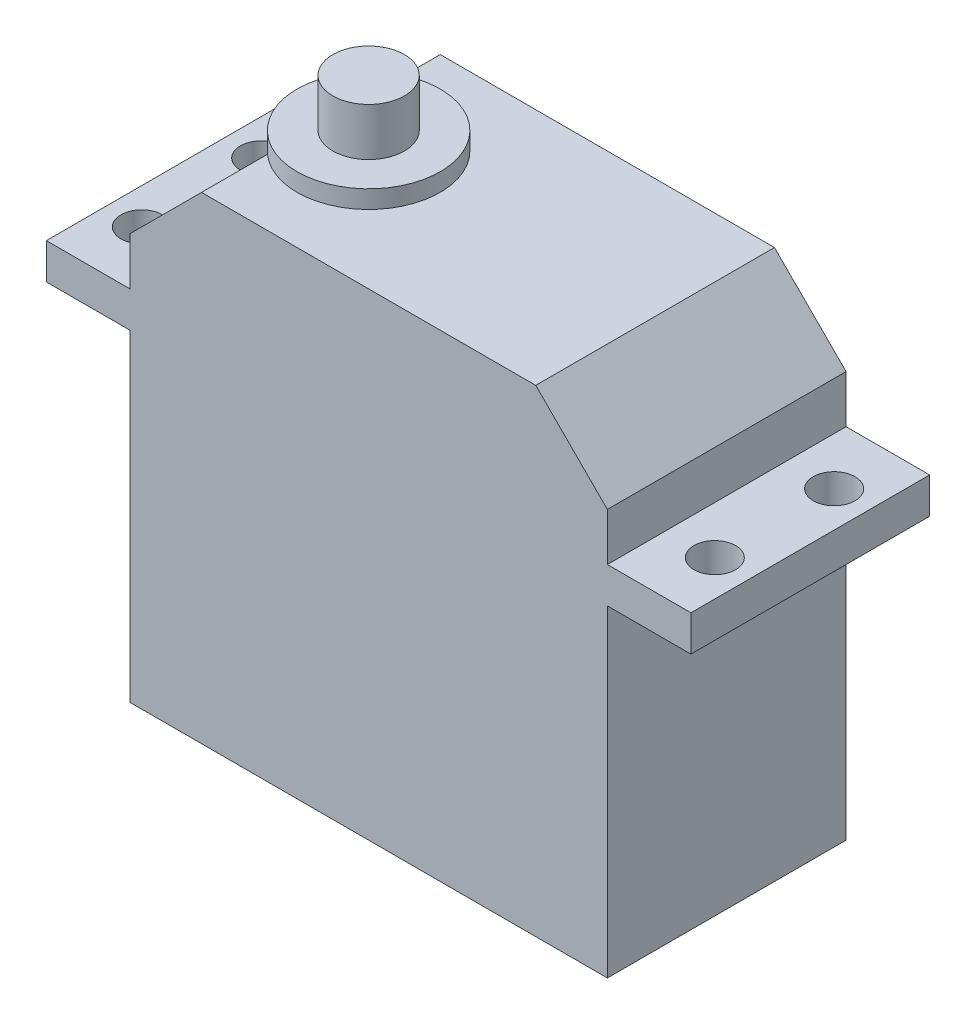
ISO-10303-21;
HEADER;
FILE_DESCRIPTION(('STEP AP214'),'2;1');
FILE_NAME('part.step','',(''),(''),'','','');
FILE_SCHEMA(('AUTOMOTIVE_DESIGN { 1 0 10303 214 1 1 1 1 }'));
ENDSEC;
DATA;
#1=APPLICATION_CONTEXT('core data for automotive mechanical design processes');
#2=APPLICATION_PROTOCOL_DEFINITION('international standard','automotive_design',2000,#1);
#3=PRODUCT_CONTEXT('',#1,'mechanical');
#4=PRODUCT('Part','Part','',(#3));
#5=PRODUCT_RELATED_PRODUCT_CATEGORY('part','',(#4));
#6=PRODUCT_DEFINITION_FORMATION('','',#4);
#7=PRODUCT_DEFINITION_CONTEXT('part definition',#1,'design');
#8=PRODUCT_DEFINITION('design','',#6,#7);
#9=PRODUCT_DEFINITION_SHAPE('','',#8);
#10=(LENGTH_UNIT() NAMED_UNIT(*) SI_UNIT(.MILLI.,.METRE.));
#11=(NAMED_UNIT(*) PLANE_ANGLE_UNIT() SI_UNIT($,.RADIAN.));
#12=(NAMED_UNIT(*) SI_UNIT($,.STERADIAN.) SOLID_ANGLE_UNIT());
#13=UNCERTAINTY_MEASURE_WITH_UNIT(LENGTH_MEASURE(1.E-05),#10,'distance_accuracy_value','');
#14=(GEOMETRIC_REPRESENTATION_CONTEXT(3) GLOBAL_UNCERTAINTY_ASSIGNED_CONTEXT((#13)) GLOBAL_UNIT_ASSIGNED_CONTEXT((#10,
#11,#12)) REPRESENTATION_CONTEXT('',''));
#15=CARTESIAN_POINT('',(0.,0.,0.));
#16=DIRECTION('',(0.,0.,1.));
#17=DIRECTION('',(1.,0.,0.));
#18=AXIS2_PLACEMENT_3D('',#15,#16,#17);
#19=CARTESIAN_POINT('',(0.,0.,10.));
#20=DIRECTION('',(1.,0.,0.));
#21=DIRECTION('',(0.,0.,-1.));
#22=AXIS2_PLACEMENT_3D('',#19,#20,#21);
#23=PLANE('',#22);
#24=DIRECTION('',(0.,0.,1.));
#25=VECTOR('',#24,1.);
#26=CARTESIAN_POINT('',(0.,27.,10.));
#27=LINE('',#26,#25);
#28=CARTESIAN_POINT('',(0.,27.,-10.));
#29=VERTEX_POINT('',#28);
#30=CARTESIAN_POINT('',(0.,27.,10.));
#31=VERTEX_POINT('',#30);
#32=EDGE_CURVE('E243',#29,#31,#27,.T.);
#33=ORIENTED_EDGE('',*,*,#32,.F.);
#34=DIRECTION('',(0.,-1.,0.));
#35=VECTOR('',#34,1.);
#36=CARTESIAN_POINT('',(0.,0.,-10.));
#37=LINE('',#36,#35);
#38=CARTESIAN_POINT('',(0.,0.,-10.));
#39=VERTEX_POINT('',#38);
#40=EDGE_CURVE('E246',#29,#39,#37,.T.);
#41=ORIENTED_EDGE('',*,*,#40,.T.);
#42=DIRECTION('',(0.,0.,-1.));
#43=VECTOR('',#42,1.);
#44=CARTESIAN_POINT('',(0.,0.,10.));
#45=LINE('',#44,#43);
#46=CARTESIAN_POINT('',(0.,0.,10.));
#47=VERTEX_POINT('',#46);
#48=EDGE_CURVE('E159',#47,#39,#45,.T.);
#49=ORIENTED_EDGE('',*,*,#48,.F.);
#50=DIRECTION('',(0.,-1.,0.));
#51=VECTOR('',#50,1.);
#52=CARTESIAN_POINT('',(0.,0.,10.));
#53=LINE('',#52,#51);
#54=EDGE_CURVE('E250',#31,#47,#53,.T.);
#55=ORIENTED_EDGE('',*,*,#54,.F.);
#56=EDGE_LOOP('',(#33,#41,#49,#55));
#57=FACE_BOUND('',#56,.T.);
#58=ADVANCED_FACE('F45',(#57),#23,.F.);
#59=CARTESIAN_POINT('',(0.,34.,10.));
#60=VERTEX_POINT('',#59);
#61=CARTESIAN_POINT('',(0.,30.,10.));
#62=VERTEX_POINT('',#61);
#63=EDGE_CURVE('E247',#60,#62,#53,.T.);
#64=ORIENTED_EDGE('',*,*,#63,.F.);
#65=DIRECTION('',(0.,0.,-1.));
#66=VECTOR('',#65,1.);
#67=CARTESIAN_POINT('',(0.,34.,10.));
#68=LINE('',#67,#66);
#69=CARTESIAN_POINT('',(0.,34.,-10.));
#70=VERTEX_POINT('',#69);
#71=EDGE_CURVE('E170',#60,#70,#68,.T.);
#72=ORIENTED_EDGE('',*,*,#71,.T.);
#73=CARTESIAN_POINT('',(0.,30.,-10.));
#74=VERTEX_POINT('',#73);
#75=EDGE_CURVE('E259',#70,#74,#37,.T.);
#76=ORIENTED_EDGE('',*,*,#75,.T.);
#77=DIRECTION('',(0.,0.,-1.));
#78=VECTOR('',#77,1.);
#79=CARTESIAN_POINT('',(0.,30.,10.));
#80=LINE('',#79,#78);
#81=EDGE_CURVE('E237',#62,#74,#80,.T.);
#82=ORIENTED_EDGE('',*,*,#81,.F.);
#83=EDGE_LOOP('',(#64,#72,#76,#82));
#84=FACE_BOUND('',#83,.T.);
#85=ADVANCED_FACE('F336',(#84),#23,.F.);
#86=CARTESIAN_POINT('',(40.,0.,10.));
#87=DIRECTION('',(-1.,0.,0.));
#88=DIRECTION('',(0.,0.,1.));
#89=AXIS2_PLACEMENT_3D('',#86,#87,#88);
#90=PLANE('',#89);
#91=DIRECTION('',(0.,0.,-1.));
#92=VECTOR('',#91,1.);
#93=CARTESIAN_POINT('',(40.,27.,10.));
#94=LINE('',#93,#92);
#95=CARTESIAN_POINT('',(40.,27.,10.));
#96=VERTEX_POINT('',#95);
#97=CARTESIAN_POINT('',(40.,27.,-10.));
#98=VERTEX_POINT('',#97);
#99=EDGE_CURVE('E240',#96,#98,#94,.T.);
#100=ORIENTED_EDGE('',*,*,#99,.F.);
#101=DIRECTION('',(0.,1.,0.));
#102=VECTOR('',#101,1.);
#103=CARTESIAN_POINT('',(40.,0.,10.));
#104=LINE('',#103,#102);
#105=CARTESIAN_POINT('',(40.,0.,10.));
#106=VERTEX_POINT('',#105);
#107=EDGE_CURVE('E253',#106,#96,#104,.T.);
#108=ORIENTED_EDGE('',*,*,#107,.F.);
#109=DIRECTION('',(0.,0.,-1.));
#110=VECTOR('',#109,1.);
#111=CARTESIAN_POINT('',(40.,0.,10.));
#112=LINE('',#111,#110);
#113=CARTESIAN_POINT('',(40.,0.,-10.));
#114=VERTEX_POINT('',#113);
#115=EDGE_CURVE('E258',#106,#114,#112,.T.);
#116=ORIENTED_EDGE('',*,*,#115,.T.);
#117=DIRECTION('',(0.,1.,0.));
#118=VECTOR('',#117,1.);
#119=CARTESIAN_POINT('',(40.,0.,-10.));
#120=LINE('',#119,#118);
#121=EDGE_CURVE('E264',#114,#98,#120,.T.);
#122=ORIENTED_EDGE('',*,*,#121,.T.);
#123=EDGE_LOOP('',(#100,#108,#116,#122));
#124=FACE_BOUND('',#123,.T.);
#125=ADVANCED_FACE('F312',(#124),#90,.F.);
#126=CARTESIAN_POINT('',(40.,30.,-10.));
#127=VERTEX_POINT('',#126);
#128=CARTESIAN_POINT('',(40.,34.,-10.));
#129=VERTEX_POINT('',#128);
#130=EDGE_CURVE('E263',#127,#129,#120,.T.);
#131=ORIENTED_EDGE('',*,*,#130,.T.);
#132=DIRECTION('',(0.,0.,1.));
#133=VECTOR('',#132,1.);
#134=CARTESIAN_POINT('',(40.,34.,10.));
#135=LINE('',#134,#133);
#136=CARTESIAN_POINT('',(40.,34.,10.));
#137=VERTEX_POINT('',#136);
#138=EDGE_CURVE('E279',#129,#137,#135,.T.);
#139=ORIENTED_EDGE('',*,*,#138,.T.);
#140=CARTESIAN_POINT('',(40.,30.,10.));
#141=VERTEX_POINT('',#140);
#142=EDGE_CURVE('E252',#141,#137,#104,.T.);
#143=ORIENTED_EDGE('',*,*,#142,.F.);
#144=DIRECTION('',(0.,0.,1.));
#145=VECTOR('',#144,1.);
#146=CARTESIAN_POINT('',(40.,30.,10.));
#147=LINE('',#146,#145);
#148=EDGE_CURVE('E234',#127,#141,#147,.T.);
#149=ORIENTED_EDGE('',*,*,#148,.F.);
#150=EDGE_LOOP('',(#131,#139,#143,#149));
#151=FACE_BOUND('',#150,.T.);
#152=ADVANCED_FACE('F295',(#151),#90,.F.);
#153=CARTESIAN_POINT('',(0.,0.,10.));
#154=DIRECTION('',(0.,1.,0.));
#155=DIRECTION('',(0.,0.,1.));
#156=AXIS2_PLACEMENT_3D('',#153,#154,#155);
#157=PLANE('',#156);
#158=DIRECTION('',(1.,0.,0.));
#159=VECTOR('',#158,1.);
#160=CARTESIAN_POINT('',(0.,0.,-10.));
#161=LINE('',#160,#159);
#162=EDGE_CURVE('E261',#39,#114,#161,.T.);
#163=ORIENTED_EDGE('',*,*,#162,.T.);
#164=ORIENTED_EDGE('',*,*,#115,.F.);
#165=DIRECTION('',(1.,0.,0.));
#166=VECTOR('',#165,1.);
#167=CARTESIAN_POINT('',(0.,0.,10.));
#168=LINE('',#167,#166);
#169=EDGE_CURVE('E249',#47,#106,#168,.T.);
#170=ORIENTED_EDGE('',*,*,#169,.F.);
#171=ORIENTED_EDGE('',*,*,#48,.T.);
#172=EDGE_LOOP('',(#163,#164,#170,#171));
#173=FACE_BOUND('',#172,.T.);
#174=ADVANCED_FACE('F317',(#173),#157,.F.);
#175=CARTESIAN_POINT('',(0.,40.,10.));
#176=DIRECTION('',(0.,-1.,0.));
#177=DIRECTION('',(0.,0.,-1.));
#178=AXIS2_PLACEMENT_3D('',#175,#176,#177);
#179=PLANE('',#178);
#180=DIRECTION('',(0.,0.,1.));
#181=VECTOR('',#180,1.);
#182=CARTESIAN_POINT('',(6.00000000000002,40.,10.));
#183=LINE('',#182,#181);
#184=CARTESIAN_POINT('',(6.00000000000002,40.,-10.));
#185=VERTEX_POINT('',#184);
#186=CARTESIAN_POINT('',(6.00000000000002,40.,-4.47213595499959));
#187=VERTEX_POINT('',#186);
#188=EDGE_CURVE('E158',#185,#187,#183,.T.);
#189=ORIENTED_EDGE('',*,*,#188,.T.);
#190=CARTESIAN_POINT('',(10.,40.,0.));
#191=DIRECTION('',(0.,-1.,0.));
#192=DIRECTION('',(0.,0.,-1.));
#193=AXIS2_PLACEMENT_3D('',#190,#191,#192);
#194=CIRCLE('',#193,6.);
#195=CARTESIAN_POINT('',(6.00000000000002,40.,4.47213595499959));
#196=VERTEX_POINT('',#195);
#197=EDGE_CURVE('E162',#187,#196,#194,.T.);
#198=ORIENTED_EDGE('',*,*,#197,.T.);
#199=CARTESIAN_POINT('',(6.00000000000002,40.,10.));
#200=VERTEX_POINT('',#199);
#201=EDGE_CURVE('E153',#196,#200,#183,.T.);
#202=ORIENTED_EDGE('',*,*,#201,.T.);
#203=DIRECTION('',(-1.,0.,0.));
#204=VECTOR('',#203,1.);
#205=CARTESIAN_POINT('',(0.,40.,10.));
#206=LINE('',#205,#204);
#207=CARTESIAN_POINT('',(34.,40.,10.));
#208=VERTEX_POINT('',#207);
#209=EDGE_CURVE('E256',#208,#200,#206,.T.);
#210=ORIENTED_EDGE('',*,*,#209,.F.);
#211=DIRECTION('',(0.,0.,-1.));
#212=VECTOR('',#211,1.);
#213=CARTESIAN_POINT('',(34.,40.,10.));
#214=LINE('',#213,#212);
#215=CARTESIAN_POINT('',(34.,40.,-10.));
#216=VERTEX_POINT('',#215);
#217=EDGE_CURVE('E272',#208,#216,#214,.T.);
#218=ORIENTED_EDGE('',*,*,#217,.T.);
#219=DIRECTION('',(-1.,0.,0.));
#220=VECTOR('',#219,1.);
#221=CARTESIAN_POINT('',(0.,40.,-10.));
#222=LINE('',#221,#220);
#223=EDGE_CURVE('E266',#216,#185,#222,.T.);
#224=ORIENTED_EDGE('',*,*,#223,.T.);
#225=EDGE_LOOP('',(#189,#198,#202,#210,#218,#224));
#226=FACE_BOUND('',#225,.T.);
#227=ADVANCED_FACE('F163',(#226),#179,.F.);
#228=CARTESIAN_POINT('',(0.,0.,10.));
#229=DIRECTION('',(0.,0.,-1.));
#230=DIRECTION('',(-1.,0.,0.));
#231=AXIS2_PLACEMENT_3D('',#228,#229,#230);
#232=PLANE('',#231);
#233=ORIENTED_EDGE('',*,*,#142,.T.);
#234=DIRECTION('',(0.707106781186546,-0.707106781186549,0.));
#235=VECTOR('',#234,1.);
#236=CARTESIAN_POINT('',(34.,40.,10.));
#237=LINE('',#236,#235);
#238=EDGE_CURVE('E173',#137,#208,#237,.F.);
#239=ORIENTED_EDGE('',*,*,#238,.T.);
#240=ORIENTED_EDGE('',*,*,#209,.T.);
#241=DIRECTION('',(0.707106781186549,0.707106781186546,0.));
#242=VECTOR('',#241,1.);
#243=CARTESIAN_POINT('',(0.,34.,10.));
#244=LINE('',#243,#242);
#245=EDGE_CURVE('E70',#200,#60,#244,.F.);
#246=ORIENTED_EDGE('',*,*,#245,.T.);
#247=ORIENTED_EDGE('',*,*,#63,.T.);
#248=DIRECTION('',(-1.,0.,0.));
#249=VECTOR('',#248,1.);
#250=CARTESIAN_POINT('',(-7.,30.,10.));
#251=LINE('',#250,#249);
#252=CARTESIAN_POINT('',(-7.,30.,10.));
#253=VERTEX_POINT('',#252);
#254=EDGE_CURVE('E207',#62,#253,#251,.T.);
#255=ORIENTED_EDGE('',*,*,#254,.T.);
#256=DIRECTION('',(0.,-1.,0.));
#257=VECTOR('',#256,1.);
#258=CARTESIAN_POINT('',(-7.,30.,10.));
#259=LINE('',#258,#257);
#260=CARTESIAN_POINT('',(-7.,27.,10.));
#261=VERTEX_POINT('',#260);
#262=EDGE_CURVE('E197',#253,#261,#259,.T.);
#263=ORIENTED_EDGE('',*,*,#262,.T.);
#264=DIRECTION('',(1.,0.,0.));
#265=VECTOR('',#264,1.);
#266=CARTESIAN_POINT('',(-7.,27.,10.));
#267=LINE('',#266,#265);
#268=EDGE_CURVE('E202',#261,#31,#267,.T.);
#269=ORIENTED_EDGE('',*,*,#268,.T.);
#270=ORIENTED_EDGE('',*,*,#54,.T.);
#271=ORIENTED_EDGE('',*,*,#169,.T.);
#272=ORIENTED_EDGE('',*,*,#107,.T.);
#273=CARTESIAN_POINT('',(47.,27.,10.));
#274=VERTEX_POINT('',#273);
#275=EDGE_CURVE('E200',#96,#274,#267,.T.);
#276=ORIENTED_EDGE('',*,*,#275,.T.);
#277=DIRECTION('',(0.,1.,0.));
#278=VECTOR('',#277,1.);
#279=CARTESIAN_POINT('',(47.,30.,10.));
#280=LINE('',#279,#278);
#281=CARTESIAN_POINT('',(47.,30.,10.));
#282=VERTEX_POINT('',#281);
#283=EDGE_CURVE('E205',#274,#282,#280,.T.);
#284=ORIENTED_EDGE('',*,*,#283,.T.);
#285=EDGE_CURVE('E208',#282,#141,#251,.T.);
#286=ORIENTED_EDGE('',*,*,#285,.T.);
#287=EDGE_LOOP('',(#233,#239,#240,#246,#247,#255,#263,#269,#270,#271,#272,#276,#284,#286));
#288=FACE_BOUND('',#287,.T.);
#289=ADVANCED_FACE('F283',(#288),#232,.F.);
#290=CARTESIAN_POINT('',(0.,0.,-10.));
#291=DIRECTION('',(0.,0.,-1.));
#292=DIRECTION('',(-1.,0.,0.));
#293=AXIS2_PLACEMENT_3D('',#290,#291,#292);
#294=PLANE('',#293);
#295=ORIENTED_EDGE('',*,*,#223,.F.);
#296=DIRECTION('',(-0.707106781186546,0.707106781186549,0.));
#297=VECTOR('',#296,1.);
#298=CARTESIAN_POINT('',(37.0000000000001,36.9999999999999,-10.));
#299=LINE('',#298,#297);
#300=EDGE_CURVE('E277',#216,#129,#299,.F.);
#301=ORIENTED_EDGE('',*,*,#300,.T.);
#302=ORIENTED_EDGE('',*,*,#130,.F.);
#303=DIRECTION('',(-1.,0.,0.));
#304=VECTOR('',#303,1.);
#305=CARTESIAN_POINT('',(-7.,30.,-10.));
#306=LINE('',#305,#304);
#307=CARTESIAN_POINT('',(47.,30.,-10.));
#308=VERTEX_POINT('',#307);
#309=EDGE_CURVE('E201',#308,#127,#306,.T.);
#310=ORIENTED_EDGE('',*,*,#309,.F.);
#311=DIRECTION('',(0.,1.,0.));
#312=VECTOR('',#311,1.);
#313=CARTESIAN_POINT('',(47.,30.,-10.));
#314=LINE('',#313,#312);
#315=CARTESIAN_POINT('',(47.,27.,-10.));
#316=VERTEX_POINT('',#315);
#317=EDGE_CURVE('E218',#316,#308,#314,.T.);
#318=ORIENTED_EDGE('',*,*,#317,.F.);
#319=DIRECTION('',(1.,0.,0.));
#320=VECTOR('',#319,1.);
#321=CARTESIAN_POINT('',(-7.,27.,-10.));
#322=LINE('',#321,#320);
#323=EDGE_CURVE('E214',#98,#316,#322,.T.);
#324=ORIENTED_EDGE('',*,*,#323,.F.);
#325=ORIENTED_EDGE('',*,*,#121,.F.);
#326=ORIENTED_EDGE('',*,*,#162,.F.);
#327=ORIENTED_EDGE('',*,*,#40,.F.);
#328=CARTESIAN_POINT('',(-7.,27.,-10.));
#329=VERTEX_POINT('',#328);
#330=EDGE_CURVE('E215',#329,#29,#322,.T.);
#331=ORIENTED_EDGE('',*,*,#330,.F.);
#332=DIRECTION('',(0.,-1.,0.));
#333=VECTOR('',#332,1.);
#334=CARTESIAN_POINT('',(-7.,30.,-10.));
#335=LINE('',#334,#333);
#336=CARTESIAN_POINT('',(-7.,30.,-10.));
#337=VERTEX_POINT('',#336);
#338=EDGE_CURVE('E166',#337,#329,#335,.T.);
#339=ORIENTED_EDGE('',*,*,#338,.F.);
#340=EDGE_CURVE('E220',#74,#337,#306,.T.);
#341=ORIENTED_EDGE('',*,*,#340,.F.);
#342=ORIENTED_EDGE('',*,*,#75,.F.);
#343=DIRECTION('',(-0.707106781186549,-0.707106781186546,0.));
#344=VECTOR('',#343,1.);
#345=CARTESIAN_POINT('',(-17.,17.0000000000001,-10.));
#346=LINE('',#345,#344);
#347=EDGE_CURVE('E275',#70,#185,#346,.F.);
#348=ORIENTED_EDGE('',*,*,#347,.T.);
#349=EDGE_LOOP('',(#295,#301,#302,#310,#318,#324,#325,#326,#327,#331,#339,#341,#342,#348));
#350=FACE_BOUND('',#349,.T.);
#351=ADVANCED_FACE('F291',(#350),#294,.T.);
#352=CARTESIAN_POINT('',(47.,30.,10.));
#353=DIRECTION('',(-1.,0.,0.));
#354=DIRECTION('',(0.,0.,1.));
#355=AXIS2_PLACEMENT_3D('',#352,#353,#354);
#356=PLANE('',#355);
#357=ORIENTED_EDGE('',*,*,#317,.T.);
#358=DIRECTION('',(0.,0.,-1.));
#359=VECTOR('',#358,1.);
#360=CARTESIAN_POINT('',(47.,30.,10.));
#361=LINE('',#360,#359);
#362=EDGE_CURVE('E225',#282,#308,#361,.T.);
#363=ORIENTED_EDGE('',*,*,#362,.F.);
#364=ORIENTED_EDGE('',*,*,#283,.F.);
#365=DIRECTION('',(0.,0.,-1.));
#366=VECTOR('',#365,1.);
#367=CARTESIAN_POINT('',(47.,27.,10.));
#368=LINE('',#367,#366);
#369=EDGE_CURVE('E228',#274,#316,#368,.T.);
#370=ORIENTED_EDGE('',*,*,#369,.T.);
#371=EDGE_LOOP('',(#357,#363,#364,#370));
#372=FACE_BOUND('',#371,.T.);
#373=ADVANCED_FACE('F304',(#372),#356,.F.);
#374=CARTESIAN_POINT('',(-7.,30.,10.));
#375=DIRECTION('',(0.,-1.,0.));
#376=DIRECTION('',(0.,0.,-1.));
#377=AXIS2_PLACEMENT_3D('',#374,#375,#376);
#378=PLANE('',#377);
#379=CARTESIAN_POINT('',(44.,30.,-5.));
#380=DIRECTION('',(0.,1.,0.));
#381=DIRECTION('',(0.,0.,1.));
#382=AXIS2_PLACEMENT_3D('',#379,#380,#381);
#383=CIRCLE('',#382,1.75);
#384=CARTESIAN_POINT('',(44.,30.,-3.25));
#385=VERTEX_POINT('',#384);
#386=EDGE_CURVE('E601',#385,#385,#383,.T.);
#387=ORIENTED_EDGE('',*,*,#386,.F.);
#388=EDGE_LOOP('',(#387));
#389=FACE_BOUND('',#388,.T.);
#390=CARTESIAN_POINT('',(44.,30.,5.));
#391=DIRECTION('',(0.,1.,0.));
#392=DIRECTION('',(0.,0.,1.));
#393=AXIS2_PLACEMENT_3D('',#390,#391,#392);
#394=CIRCLE('',#393,1.75);
#395=CARTESIAN_POINT('',(44.,30.,6.75));
#396=VERTEX_POINT('',#395);
#397=EDGE_CURVE('E604',#396,#396,#394,.T.);
#398=ORIENTED_EDGE('',*,*,#397,.F.);
#399=EDGE_LOOP('',(#398));
#400=FACE_BOUND('',#399,.T.);
#401=ORIENTED_EDGE('',*,*,#309,.T.);
#402=ORIENTED_EDGE('',*,*,#148,.T.);
#403=ORIENTED_EDGE('',*,*,#285,.F.);
#404=ORIENTED_EDGE('',*,*,#362,.T.);
#405=EDGE_LOOP('',(#401,#402,#403,#404));
#406=FACE_BOUND('',#405,.T.);
#407=ADVANCED_FACE('F298',(#389,#400,#406),#378,.F.);
#408=CARTESIAN_POINT('',(-7.,27.,10.));
#409=DIRECTION('',(0.,1.,0.));
#410=DIRECTION('',(0.,0.,1.));
#411=AXIS2_PLACEMENT_3D('',#408,#409,#410);
#412=PLANE('',#411);
#413=CARTESIAN_POINT('',(44.,27.,-5.));
#414=DIRECTION('',(0.,1.,0.));
#415=DIRECTION('',(0.,0.,1.));
#416=AXIS2_PLACEMENT_3D('',#413,#414,#415);
#417=CIRCLE('',#416,1.75);
#418=CARTESIAN_POINT('',(44.,27.,-3.25));
#419=VERTEX_POINT('',#418);
#420=EDGE_CURVE('E50',#419,#419,#417,.T.);
#421=ORIENTED_EDGE('',*,*,#420,.T.);
#422=EDGE_LOOP('',(#421));
#423=FACE_BOUND('',#422,.T.);
#424=CARTESIAN_POINT('',(44.,27.,5.));
#425=DIRECTION('',(0.,1.,0.));
#426=DIRECTION('',(0.,0.,1.));
#427=AXIS2_PLACEMENT_3D('',#424,#425,#426);
#428=CIRCLE('',#427,1.75);
#429=CARTESIAN_POINT('',(44.,27.,6.75));
#430=VERTEX_POINT('',#429);
#431=EDGE_CURVE('E176',#430,#430,#428,.T.);
#432=ORIENTED_EDGE('',*,*,#431,.T.);
#433=EDGE_LOOP('',(#432));
#434=FACE_BOUND('',#433,.T.);
#435=ORIENTED_EDGE('',*,*,#275,.F.);
#436=ORIENTED_EDGE('',*,*,#99,.T.);
#437=ORIENTED_EDGE('',*,*,#323,.T.);
#438=ORIENTED_EDGE('',*,*,#369,.F.);
#439=EDGE_LOOP('',(#435,#436,#437,#438));
#440=FACE_BOUND('',#439,.T.);
#441=ADVANCED_FACE('F309',(#423,#434,#440),#412,.F.);
#442=CARTESIAN_POINT('',(-3.99999999999999,27.,5.));
#443=DIRECTION('',(0.,1.,0.));
#444=DIRECTION('',(0.,0.,1.));
#445=AXIS2_PLACEMENT_3D('',#442,#443,#444);
#446=CIRCLE('',#445,1.75);
#447=CARTESIAN_POINT('',(-3.99999999999999,27.,6.75));
#448=VERTEX_POINT('',#447);
#449=EDGE_CURVE('E178',#448,#448,#446,.T.);
#450=ORIENTED_EDGE('',*,*,#449,.T.);
#451=EDGE_LOOP('',(#450));
#452=FACE_BOUND('',#451,.T.);
#453=CARTESIAN_POINT('',(-3.99999999999999,27.,-5.));
#454=DIRECTION('',(0.,1.,0.));
#455=DIRECTION('',(0.,0.,1.));
#456=AXIS2_PLACEMENT_3D('',#453,#454,#455);
#457=CIRCLE('',#456,1.75);
#458=CARTESIAN_POINT('',(-3.99999999999999,27.,-3.25));
#459=VERTEX_POINT('',#458);
#460=EDGE_CURVE('E184',#459,#459,#457,.T.);
#461=ORIENTED_EDGE('',*,*,#460,.T.);
#462=EDGE_LOOP('',(#461));
#463=FACE_BOUND('',#462,.T.);
#464=ORIENTED_EDGE('',*,*,#330,.T.);
#465=ORIENTED_EDGE('',*,*,#32,.T.);
#466=ORIENTED_EDGE('',*,*,#268,.F.);
#467=DIRECTION('',(0.,0.,-1.));
#468=VECTOR('',#467,1.);
#469=CARTESIAN_POINT('',(-7.,27.,10.));
#470=LINE('',#469,#468);
#471=EDGE_CURVE('E231',#261,#329,#470,.T.);
#472=ORIENTED_EDGE('',*,*,#471,.T.);
#473=EDGE_LOOP('',(#464,#465,#466,#472));
#474=FACE_BOUND('',#473,.T.);
#475=ADVANCED_FACE('F322',(#452,#463,#474),#412,.F.);
#476=CARTESIAN_POINT('',(-3.99999999999999,30.,5.));
#477=DIRECTION('',(0.,1.,0.));
#478=DIRECTION('',(0.,0.,1.));
#479=AXIS2_PLACEMENT_3D('',#476,#477,#478);
#480=CIRCLE('',#479,1.75);
#481=CARTESIAN_POINT('',(-3.99999999999999,30.,6.75));
#482=VERTEX_POINT('',#481);
#483=EDGE_CURVE('E603',#482,#482,#480,.T.);
#484=ORIENTED_EDGE('',*,*,#483,.F.);
#485=EDGE_LOOP('',(#484));
#486=FACE_BOUND('',#485,.T.);
#487=CARTESIAN_POINT('',(-3.99999999999999,30.,-5.));
#488=DIRECTION('',(0.,1.,0.));
#489=DIRECTION('',(0.,0.,1.));
#490=AXIS2_PLACEMENT_3D('',#487,#488,#489);
#491=CIRCLE('',#490,1.75);
#492=CARTESIAN_POINT('',(-3.99999999999999,30.,-3.25));
#493=VERTEX_POINT('',#492);
#494=EDGE_CURVE('E189',#493,#493,#491,.T.);
#495=ORIENTED_EDGE('',*,*,#494,.F.);
#496=EDGE_LOOP('',(#495));
#497=FACE_BOUND('',#496,.T.);
#498=ORIENTED_EDGE('',*,*,#254,.F.);
#499=ORIENTED_EDGE('',*,*,#81,.T.);
#500=ORIENTED_EDGE('',*,*,#340,.T.);
#501=DIRECTION('',(0.,0.,-1.));
#502=VECTOR('',#501,1.);
#503=CARTESIAN_POINT('',(-7.,30.,10.));
#504=LINE('',#503,#502);
#505=EDGE_CURVE('E211',#253,#337,#504,.T.);
#506=ORIENTED_EDGE('',*,*,#505,.F.);
#507=EDGE_LOOP('',(#498,#499,#500,#506));
#508=FACE_BOUND('',#507,.T.);
#509=ADVANCED_FACE('F333',(#486,#497,#508),#378,.F.);
#510=CARTESIAN_POINT('',(-7.,30.,10.));
#511=DIRECTION('',(1.,0.,0.));
#512=DIRECTION('',(0.,0.,-1.));
#513=AXIS2_PLACEMENT_3D('',#510,#511,#512);
#514=PLANE('',#513);
#515=ORIENTED_EDGE('',*,*,#338,.T.);
#516=ORIENTED_EDGE('',*,*,#471,.F.);
#517=ORIENTED_EDGE('',*,*,#262,.F.);
#518=ORIENTED_EDGE('',*,*,#505,.T.);
#519=EDGE_LOOP('',(#515,#516,#517,#518));
#520=FACE_BOUND('',#519,.T.);
#521=ADVANCED_FACE('F328',(#520),#514,.F.);
#522=CARTESIAN_POINT('',(34.,40.,10.));
#523=DIRECTION('',(-0.707106781186549,-0.707106781186546,0.));
#524=DIRECTION('',(0.,0.,-1.));
#525=AXIS2_PLACEMENT_3D('',#522,#523,#524);
#526=PLANE('',#525);
#527=ORIENTED_EDGE('',*,*,#238,.F.);
#528=ORIENTED_EDGE('',*,*,#138,.F.);
#529=ORIENTED_EDGE('',*,*,#300,.F.);
#530=ORIENTED_EDGE('',*,*,#217,.F.);
#531=EDGE_LOOP('',(#527,#528,#529,#530));
#532=FACE_BOUND('',#531,.T.);
#533=ADVANCED_FACE('F288',(#532),#526,.F.);
#534=CARTESIAN_POINT('',(0.,34.,10.));
#535=DIRECTION('',(0.707106781186546,-0.707106781186549,0.));
#536=DIRECTION('',(0.,0.,-1.));
#537=AXIS2_PLACEMENT_3D('',#534,#535,#536);
#538=PLANE('',#537);
#539=CARTESIAN_POINT('',(10.,44.,0.));
#540=DIRECTION('',(0.707106781186546,-0.707106781186549,0.));
#541=DIRECTION('',(0.707106781186549,0.707106781186546,0.));
#542=AXIS2_PLACEMENT_3D('',#539,#540,#541);
#543=ELLIPSE('',#542,8.48528137423856,6.);
#544=EDGE_CURVE('E55',#187,#196,#543,.F.);
#545=ORIENTED_EDGE('',*,*,#544,.F.);
#546=ORIENTED_EDGE('',*,*,#188,.F.);
#547=ORIENTED_EDGE('',*,*,#347,.F.);
#548=ORIENTED_EDGE('',*,*,#71,.F.);
#549=ORIENTED_EDGE('',*,*,#245,.F.);
#550=ORIENTED_EDGE('',*,*,#201,.F.);
#551=EDGE_LOOP('',(#545,#546,#547,#548,#549,#550));
#552=FACE_BOUND('',#551,.T.);
#553=ADVANCED_FACE('F48',(#552),#538,.F.);
#554=CARTESIAN_POINT('',(10.,20.,0.));
#555=DIRECTION('',(0.,1.,0.));
#556=DIRECTION('',(0.,0.,1.));
#557=AXIS2_PLACEMENT_3D('',#554,#555,#556);
#558=CYLINDRICAL_SURFACE('',#557,6.);
#559=CARTESIAN_POINT('',(10.,41.5,0.));
#560=DIRECTION('',(0.,1.,0.));
#561=DIRECTION('',(0.,0.,1.));
#562=AXIS2_PLACEMENT_3D('',#559,#560,#561);
#563=CIRCLE('',#562,6.);
#564=CARTESIAN_POINT('',(10.,41.5,6.));
#565=VERTEX_POINT('',#564);
#566=EDGE_CURVE('E167',#565,#565,#563,.T.);
#567=ORIENTED_EDGE('',*,*,#566,.F.);
#568=EDGE_LOOP('',(#567));
#569=FACE_BOUND('',#568,.T.);
#570=ORIENTED_EDGE('',*,*,#197,.F.);
#571=ORIENTED_EDGE('',*,*,#544,.T.);
#572=EDGE_LOOP('',(#570,#571));
#573=FACE_BOUND('',#572,.T.);
#574=ADVANCED_FACE('F169',(#569,#573),#558,.T.);
#575=CARTESIAN_POINT('',(10.,41.5,0.));
#576=DIRECTION('',(0.,1.,0.));
#577=DIRECTION('',(0.,0.,1.));
#578=AXIS2_PLACEMENT_3D('',#575,#576,#577);
#579=PLANE('',#578);
#580=CARTESIAN_POINT('',(10.,41.5,0.));
#581=DIRECTION('',(0.,1.,0.));
#582=DIRECTION('',(0.,0.,1.));
#583=AXIS2_PLACEMENT_3D('',#580,#581,#582);
#584=CIRCLE('',#583,3.);
#585=CARTESIAN_POINT('',(10.,41.5,3.));
#586=VERTEX_POINT('',#585);
#587=EDGE_CURVE('E11',#586,#586,#584,.T.);
#588=ORIENTED_EDGE('',*,*,#587,.F.);
#589=EDGE_LOOP('',(#588));
#590=FACE_BOUND('',#589,.T.);
#591=ORIENTED_EDGE('',*,*,#566,.T.);
#592=EDGE_LOOP('',(#591));
#593=FACE_BOUND('',#592,.T.);
#594=ADVANCED_FACE('F474',(#590,#593),#579,.T.);
#595=CARTESIAN_POINT('',(10.,45.5,0.));
#596=DIRECTION('',(0.,-1.,0.));
#597=DIRECTION('',(0.,0.,-1.));
#598=AXIS2_PLACEMENT_3D('',#595,#596,#597);
#599=CYLINDRICAL_SURFACE('',#598,3.);
#600=CARTESIAN_POINT('',(10.,45.5,0.));
#601=DIRECTION('',(0.,1.,0.));
#602=DIRECTION('',(0.,0.,1.));
#603=AXIS2_PLACEMENT_3D('',#600,#601,#602);
#604=CIRCLE('',#603,3.);
#605=CARTESIAN_POINT('',(10.,45.5,3.));
#606=VERTEX_POINT('',#605);
#607=EDGE_CURVE('E182',#606,#606,#604,.T.);
#608=ORIENTED_EDGE('',*,*,#607,.F.);
#609=EDGE_LOOP('',(#608));
#610=FACE_BOUND('',#609,.T.);
#611=ORIENTED_EDGE('',*,*,#587,.T.);
#612=EDGE_LOOP('',(#611));
#613=FACE_BOUND('',#612,.T.);
#614=ADVANCED_FACE('F484',(#610,#613),#599,.T.);
#615=CARTESIAN_POINT('',(10.,45.5,0.));
#616=DIRECTION('',(0.,1.,0.));
#617=DIRECTION('',(0.,0.,1.));
#618=AXIS2_PLACEMENT_3D('',#615,#616,#617);
#619=PLANE('',#618);
#620=ORIENTED_EDGE('',*,*,#607,.T.);
#621=EDGE_LOOP('',(#620));
#622=FACE_BOUND('',#621,.T.);
#623=ADVANCED_FACE('F494',(#622),#619,.T.);
#624=CARTESIAN_POINT('',(-3.99999999999999,0.,-5.));
#625=DIRECTION('',(0.,1.,0.));
#626=DIRECTION('',(0.,0.,1.));
#627=AXIS2_PLACEMENT_3D('',#624,#625,#626);
#628=CYLINDRICAL_SURFACE('',#627,1.75);
#629=ORIENTED_EDGE('',*,*,#494,.T.);
#630=EDGE_LOOP('',(#629));
#631=FACE_BOUND('',#630,.T.);
#632=ORIENTED_EDGE('',*,*,#460,.F.);
#633=EDGE_LOOP('',(#632));
#634=FACE_BOUND('',#633,.T.);
#635=ADVANCED_FACE('F503',(#631,#634),#628,.F.);
#636=CARTESIAN_POINT('',(-3.99999999999999,0.,5.));
#637=DIRECTION('',(0.,1.,0.));
#638=DIRECTION('',(0.,0.,1.));
#639=AXIS2_PLACEMENT_3D('',#636,#637,#638);
#640=CYLINDRICAL_SURFACE('',#639,1.75);
#641=ORIENTED_EDGE('',*,*,#483,.T.);
#642=EDGE_LOOP('',(#641));
#643=FACE_BOUND('',#642,.T.);
#644=ORIENTED_EDGE('',*,*,#449,.F.);
#645=EDGE_LOOP('',(#644));
#646=FACE_BOUND('',#645,.T.);
#647=ADVANCED_FACE('F512',(#643,#646),#640,.F.);
#648=CARTESIAN_POINT('',(44.,0.,5.));
#649=DIRECTION('',(0.,1.,0.));
#650=DIRECTION('',(0.,0.,1.));
#651=AXIS2_PLACEMENT_3D('',#648,#649,#650);
#652=CYLINDRICAL_SURFACE('',#651,1.75);
#653=ORIENTED_EDGE('',*,*,#397,.T.);
#654=EDGE_LOOP('',(#653));
#655=FACE_BOUND('',#654,.T.);
#656=ORIENTED_EDGE('',*,*,#431,.F.);
#657=EDGE_LOOP('',(#656));
#658=FACE_BOUND('',#657,.T.);
#659=ADVANCED_FACE('F522',(#655,#658),#652,.F.);
#660=CARTESIAN_POINT('',(44.,0.,-5.));
#661=DIRECTION('',(0.,1.,0.));
#662=DIRECTION('',(0.,0.,1.));
#663=AXIS2_PLACEMENT_3D('',#660,#661,#662);
#664=CYLINDRICAL_SURFACE('',#663,1.75);
#665=ORIENTED_EDGE('',*,*,#386,.T.);
#666=EDGE_LOOP('',(#665));
#667=FACE_BOUND('',#666,.T.);
#668=ORIENTED_EDGE('',*,*,#420,.F.);
#669=EDGE_LOOP('',(#668));
#670=FACE_BOUND('',#669,.T.);
#671=ADVANCED_FACE('F532',(#667,#670),#664,.F.);
#672=CLOSED_SHELL('',(#58,#85,#125,#152,#174,#227,#289,#351,#373,#407,#441,#475,#509,#521,#533,
#553,#574,#594,#614,#623,#635,#647,#659,#671));
#673=MANIFOLD_SOLID_BREP('B2',#672);
#674=ADVANCED_BREP_SHAPE_REPRESENTATION('',(#18,#673),#14);
#675=SHAPE_DEFINITION_REPRESENTATION(#9,#674);
ENDSEC;
END-ISO-10303-21;
